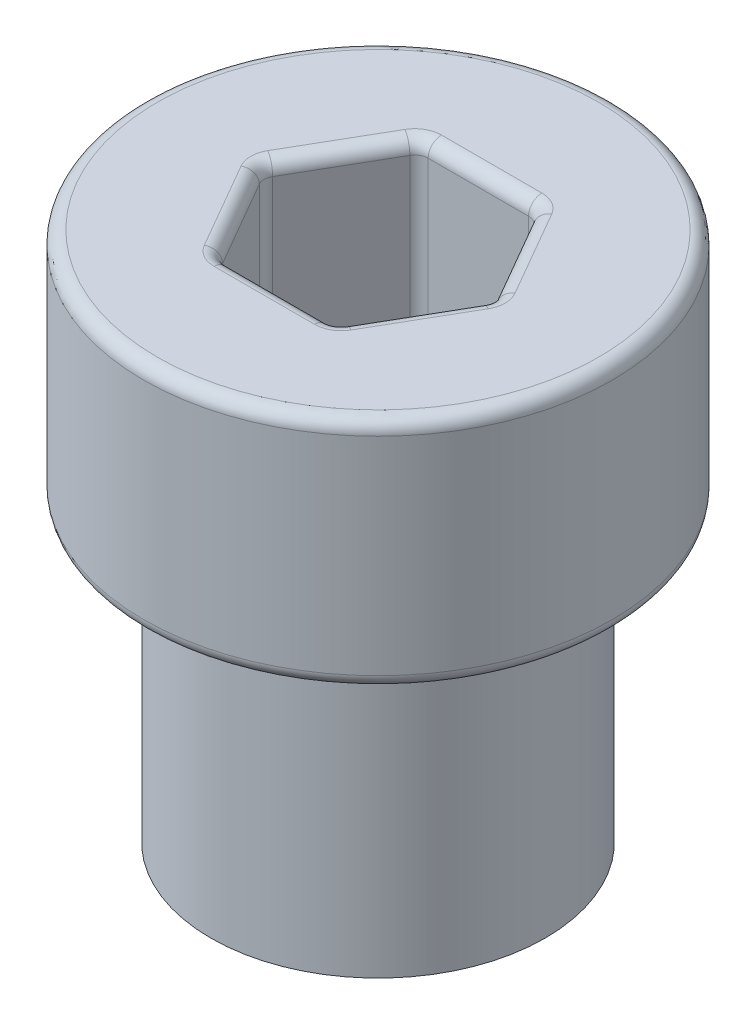
ISO-10303-21;
HEADER;
FILE_DESCRIPTION(('STEP AP214'),'2;1');
FILE_NAME('part.step','',(''),(''),'','','');
FILE_SCHEMA(('AUTOMOTIVE_DESIGN { 1 0 10303 214 1 1 1 1 }'));
ENDSEC;
DATA;
#1=APPLICATION_CONTEXT('core data for automotive mechanical design processes');
#2=APPLICATION_PROTOCOL_DEFINITION('international standard','automotive_design',2000,#1);
#3=PRODUCT_CONTEXT('',#1,'mechanical');
#4=PRODUCT('Part','Part','',(#3));
#5=PRODUCT_RELATED_PRODUCT_CATEGORY('part','',(#4));
#6=PRODUCT_DEFINITION_FORMATION('','',#4);
#7=PRODUCT_DEFINITION_CONTEXT('part definition',#1,'design');
#8=PRODUCT_DEFINITION('design','',#6,#7);
#9=PRODUCT_DEFINITION_SHAPE('','',#8);
#10=(LENGTH_UNIT() NAMED_UNIT(*) SI_UNIT(.MILLI.,.METRE.));
#11=(NAMED_UNIT(*) PLANE_ANGLE_UNIT() SI_UNIT($,.RADIAN.));
#12=(NAMED_UNIT(*) SI_UNIT($,.STERADIAN.) SOLID_ANGLE_UNIT());
#13=UNCERTAINTY_MEASURE_WITH_UNIT(LENGTH_MEASURE(1.E-05),#10,'distance_accuracy_value','');
#14=(GEOMETRIC_REPRESENTATION_CONTEXT(3) GLOBAL_UNCERTAINTY_ASSIGNED_CONTEXT((#13)) GLOBAL_UNIT_ASSIGNED_CONTEXT((#10,
#11,#12)) REPRESENTATION_CONTEXT('',''));
#15=CARTESIAN_POINT('',(0.,0.,0.));
#16=DIRECTION('',(0.,0.,1.));
#17=DIRECTION('',(1.,0.,0.));
#18=AXIS2_PLACEMENT_3D('',#15,#16,#17);
#19=CARTESIAN_POINT('',(0.,3.5,0.));
#20=DIRECTION('',(0.,1.,0.));
#21=DIRECTION('',(0.,0.,1.));
#22=AXIS2_PLACEMENT_3D('',#19,#20,#21);
#23=PLANE('',#22);
#24=CARTESIAN_POINT('',(0.,3.5,0.));
#25=DIRECTION('',(0.,1.,0.));
#26=DIRECTION('',(0.,0.,1.));
#27=AXIS2_PLACEMENT_3D('',#24,#25,#26);
#28=CIRCLE('',#27,3.3);
#29=CARTESIAN_POINT('',(0.,3.5,3.3));
#30=VERTEX_POINT('',#29);
#31=EDGE_CURVE('E896',#30,#30,#28,.T.);
#32=ORIENTED_EDGE('',*,*,#31,.T.);
#33=EDGE_LOOP('',(#32));
#34=FACE_BOUND('',#33,.T.);
#35=CARTESIAN_POINT('',(-0.750555349946514,3.5,-1.3));
#36=DIRECTION('',(0.,1.,0.));
#37=DIRECTION('',(0.,0.,1.));
#38=AXIS2_PLACEMENT_3D('',#35,#36,#37);
#39=CIRCLE('',#38,0.4);
#40=CARTESIAN_POINT('',(-0.750555349946514,3.5,-1.7));
#41=VERTEX_POINT('',#40);
#42=CARTESIAN_POINT('',(-1.09696551146029,3.5,-1.5));
#43=VERTEX_POINT('',#42);
#44=EDGE_CURVE('E889',#41,#43,#39,.T.);
#45=ORIENTED_EDGE('',*,*,#44,.F.);
#46=DIRECTION('',(-1.,0.,0.));
#47=VECTOR('',#46,1.);
#48=CARTESIAN_POINT('',(0.,3.5,-1.7));
#49=LINE('',#48,#47);
#50=CARTESIAN_POINT('',(0.750555349946513,3.5,-1.7));
#51=VERTEX_POINT('',#50);
#52=EDGE_CURVE('E887',#41,#51,#49,.F.);
#53=ORIENTED_EDGE('',*,*,#52,.T.);
#54=CARTESIAN_POINT('',(0.750555349946513,3.5,-1.3));
#55=DIRECTION('',(0.,1.,0.));
#56=DIRECTION('',(0.,0.,1.));
#57=AXIS2_PLACEMENT_3D('',#54,#55,#56);
#58=CIRCLE('',#57,0.4);
#59=CARTESIAN_POINT('',(1.09696551146029,3.5,-1.5));
#60=VERTEX_POINT('',#59);
#61=EDGE_CURVE('E884',#60,#51,#58,.T.);
#62=ORIENTED_EDGE('',*,*,#61,.F.);
#63=DIRECTION('',(-0.5,0.,-0.866025403784439));
#64=VECTOR('',#63,1.);
#65=CARTESIAN_POINT('',(1.47224318643355,3.5,-0.85));
#66=LINE('',#65,#64);
#67=CARTESIAN_POINT('',(1.8475208614068,3.5,-0.2));
#68=VERTEX_POINT('',#67);
#69=EDGE_CURVE('E911',#60,#68,#66,.F.);
#70=ORIENTED_EDGE('',*,*,#69,.T.);
#71=CARTESIAN_POINT('',(1.50111069989303,3.5,0.));
#72=DIRECTION('',(0.,1.,0.));
#73=DIRECTION('',(0.,0.,1.));
#74=AXIS2_PLACEMENT_3D('',#71,#72,#73);
#75=CIRCLE('',#74,0.4);
#76=CARTESIAN_POINT('',(1.8475208614068,3.5,0.2));
#77=VERTEX_POINT('',#76);
#78=EDGE_CURVE('E205',#77,#68,#75,.T.);
#79=ORIENTED_EDGE('',*,*,#78,.F.);
#80=DIRECTION('',(0.5,0.,-0.866025403784439));
#81=VECTOR('',#80,1.);
#82=CARTESIAN_POINT('',(1.47224318643355,3.5,0.85));
#83=LINE('',#82,#81);
#84=CARTESIAN_POINT('',(1.09696551146029,3.5,1.5));
#85=VERTEX_POINT('',#84);
#86=EDGE_CURVE('E206',#77,#85,#83,.F.);
#87=ORIENTED_EDGE('',*,*,#86,.T.);
#88=CARTESIAN_POINT('',(0.750555349946514,3.5,1.3));
#89=DIRECTION('',(0.,1.,0.));
#90=DIRECTION('',(0.,0.,1.));
#91=AXIS2_PLACEMENT_3D('',#88,#89,#90);
#92=CIRCLE('',#91,0.4);
#93=CARTESIAN_POINT('',(0.750555349946514,3.5,1.7));
#94=VERTEX_POINT('',#93);
#95=EDGE_CURVE('E916',#94,#85,#92,.T.);
#96=ORIENTED_EDGE('',*,*,#95,.F.);
#97=DIRECTION('',(1.,0.,0.));
#98=VECTOR('',#97,1.);
#99=CARTESIAN_POINT('',(0.,3.5,1.7));
#100=LINE('',#99,#98);
#101=CARTESIAN_POINT('',(-0.750555349946513,3.5,1.7));
#102=VERTEX_POINT('',#101);
#103=EDGE_CURVE('E189',#94,#102,#100,.F.);
#104=ORIENTED_EDGE('',*,*,#103,.T.);
#105=CARTESIAN_POINT('',(-0.750555349946513,3.5,1.3));
#106=DIRECTION('',(0.,1.,0.));
#107=DIRECTION('',(0.,0.,1.));
#108=AXIS2_PLACEMENT_3D('',#105,#106,#107);
#109=CIRCLE('',#108,0.4);
#110=CARTESIAN_POINT('',(-1.09696551146029,3.5,1.5));
#111=VERTEX_POINT('',#110);
#112=EDGE_CURVE('E184',#111,#102,#109,.T.);
#113=ORIENTED_EDGE('',*,*,#112,.F.);
#114=DIRECTION('',(0.5,0.,0.866025403784439));
#115=VECTOR('',#114,1.);
#116=CARTESIAN_POINT('',(-1.47224318643355,3.5,0.85));
#117=LINE('',#116,#115);
#118=CARTESIAN_POINT('',(-1.8475208614068,3.5,0.2));
#119=VERTEX_POINT('',#118);
#120=EDGE_CURVE('E186',#111,#119,#117,.F.);
#121=ORIENTED_EDGE('',*,*,#120,.T.);
#122=CARTESIAN_POINT('',(-1.50111069989303,3.5,0.));
#123=DIRECTION('',(0.,1.,0.));
#124=DIRECTION('',(0.,0.,1.));
#125=AXIS2_PLACEMENT_3D('',#122,#123,#124);
#126=CIRCLE('',#125,0.4);
#127=CARTESIAN_POINT('',(-1.8475208614068,3.5,-0.2));
#128=VERTEX_POINT('',#127);
#129=EDGE_CURVE('E891',#128,#119,#126,.T.);
#130=ORIENTED_EDGE('',*,*,#129,.F.);
#131=DIRECTION('',(-0.5,0.,0.866025403784439));
#132=VECTOR('',#131,1.);
#133=CARTESIAN_POINT('',(-1.47224318643355,3.5,-0.85));
#134=LINE('',#133,#132);
#135=EDGE_CURVE('E444',#128,#43,#134,.F.);
#136=ORIENTED_EDGE('',*,*,#135,.T.);
#137=EDGE_LOOP('',(#45,#53,#62,#70,#79,#87,#96,#104,#113,#121,#130,#136));
#138=FACE_BOUND('',#137,.T.);
#139=ADVANCED_FACE('F41',(#34,#138),#23,.T.);
#140=CARTESIAN_POINT('',(0.,0.,0.));
#141=DIRECTION('',(0.,1.,0.));
#142=DIRECTION('',(0.,0.,1.));
#143=AXIS2_PLACEMENT_3D('',#140,#141,#142);
#144=PLANE('',#143);
#145=CARTESIAN_POINT('',(0.,0.,0.));
#146=DIRECTION('',(0.,1.,0.));
#147=DIRECTION('',(0.,0.,1.));
#148=AXIS2_PLACEMENT_3D('',#145,#146,#147);
#149=CIRCLE('',#148,3.3);
#150=CARTESIAN_POINT('',(0.,0.,3.3));
#151=VERTEX_POINT('',#150);
#152=EDGE_CURVE('E194',#151,#151,#149,.F.);
#153=ORIENTED_EDGE('',*,*,#152,.T.);
#154=EDGE_LOOP('',(#153));
#155=FACE_BOUND('',#154,.T.);
#156=CARTESIAN_POINT('',(0.,0.,0.));
#157=DIRECTION('',(0.,1.,0.));
#158=DIRECTION('',(0.,0.,1.));
#159=AXIS2_PLACEMENT_3D('',#156,#157,#158);
#160=CIRCLE('',#159,2.5);
#161=CARTESIAN_POINT('',(0.,0.,2.5));
#162=VERTEX_POINT('',#161);
#163=EDGE_CURVE('E233',#162,#162,#160,.T.);
#164=ORIENTED_EDGE('',*,*,#163,.T.);
#165=EDGE_LOOP('',(#164));
#166=FACE_BOUND('',#165,.T.);
#167=ADVANCED_FACE('F464',(#155,#166),#144,.F.);
#168=CARTESIAN_POINT('',(0.,3.5,0.));
#169=DIRECTION('',(0.,-1.,0.));
#170=DIRECTION('',(0.,0.,-1.));
#171=AXIS2_PLACEMENT_3D('',#168,#169,#170);
#172=CYLINDRICAL_SURFACE('',#171,3.5);
#173=CARTESIAN_POINT('',(0.,0.2,0.));
#174=DIRECTION('',(0.,1.,0.));
#175=DIRECTION('',(0.,0.,1.));
#176=AXIS2_PLACEMENT_3D('',#173,#174,#175);
#177=CIRCLE('',#176,3.5);
#178=CARTESIAN_POINT('',(0.,0.2,3.5));
#179=VERTEX_POINT('',#178);
#180=EDGE_CURVE('E921',#179,#179,#177,.T.);
#181=ORIENTED_EDGE('',*,*,#180,.T.);
#182=EDGE_LOOP('',(#181));
#183=FACE_BOUND('',#182,.T.);
#184=CARTESIAN_POINT('',(0.,3.3,0.));
#185=DIRECTION('',(0.,1.,0.));
#186=DIRECTION('',(0.,0.,1.));
#187=AXIS2_PLACEMENT_3D('',#184,#185,#186);
#188=CIRCLE('',#187,3.5);
#189=CARTESIAN_POINT('',(0.,3.3,3.5));
#190=VERTEX_POINT('',#189);
#191=EDGE_CURVE('E924',#190,#190,#188,.F.);
#192=ORIENTED_EDGE('',*,*,#191,.T.);
#193=EDGE_LOOP('',(#192));
#194=FACE_BOUND('',#193,.T.);
#195=ADVANCED_FACE('F470',(#183,#194),#172,.T.);
#196=CARTESIAN_POINT('',(0.866025403784438,3.5,-1.5));
#197=DIRECTION('',(0.,0.,1.));
#198=DIRECTION('',(1.,0.,0.));
#199=AXIS2_PLACEMENT_3D('',#196,#197,#198);
#200=PLANE('',#199);
#201=DIRECTION('',(0.,-1.,0.));
#202=VECTOR('',#201,1.);
#203=CARTESIAN_POINT('',(0.750555349946513,3.5,-1.5));
#204=LINE('',#203,#202);
#205=CARTESIAN_POINT('',(0.750555349946513,0.2,-1.5));
#206=VERTEX_POINT('',#205);
#207=CARTESIAN_POINT('',(0.750555349946513,3.3,-1.5));
#208=VERTEX_POINT('',#207);
#209=EDGE_CURVE('E372',#206,#208,#204,.F.);
#210=ORIENTED_EDGE('',*,*,#209,.T.);
#211=DIRECTION('',(-1.,0.,0.));
#212=VECTOR('',#211,1.);
#213=CARTESIAN_POINT('',(0.866025403784438,3.3,-1.5));
#214=LINE('',#213,#212);
#215=CARTESIAN_POINT('',(-0.750555349946514,3.3,-1.5));
#216=VERTEX_POINT('',#215);
#217=EDGE_CURVE('E367',#208,#216,#214,.T.);
#218=ORIENTED_EDGE('',*,*,#217,.T.);
#219=DIRECTION('',(0.,-1.,0.));
#220=VECTOR('',#219,1.);
#221=CARTESIAN_POINT('',(-0.750555349946514,0.,-1.5));
#222=LINE('',#221,#220);
#223=CARTESIAN_POINT('',(-0.750555349946514,0.2,-1.5));
#224=VERTEX_POINT('',#223);
#225=EDGE_CURVE('E875',#216,#224,#222,.T.);
#226=ORIENTED_EDGE('',*,*,#225,.T.);
#227=DIRECTION('',(-1.,0.,0.));
#228=VECTOR('',#227,1.);
#229=CARTESIAN_POINT('',(0.866025403784438,0.2,-1.5));
#230=LINE('',#229,#228);
#231=EDGE_CURVE('E428',#224,#206,#230,.F.);
#232=ORIENTED_EDGE('',*,*,#231,.T.);
#233=EDGE_LOOP('',(#210,#218,#226,#232));
#234=FACE_BOUND('',#233,.T.);
#235=ADVANCED_FACE('F475',(#234),#200,.T.);
#236=CARTESIAN_POINT('',(-0.866025403784439,3.5,-1.5));
#237=DIRECTION('',(0.866025403784439,0.,0.5));
#238=DIRECTION('',(0.5,0.,-0.866025403784439));
#239=AXIS2_PLACEMENT_3D('',#236,#237,#238);
#240=PLANE('',#239);
#241=DIRECTION('',(0.,-1.,0.));
#242=VECTOR('',#241,1.);
#243=CARTESIAN_POINT('',(-0.923760430703402,3.5,-1.4));
#244=LINE('',#243,#242);
#245=CARTESIAN_POINT('',(-0.923760430703402,0.2,-1.4));
#246=VERTEX_POINT('',#245);
#247=CARTESIAN_POINT('',(-0.923760430703402,3.3,-1.4));
#248=VERTEX_POINT('',#247);
#249=EDGE_CURVE('E369',#246,#248,#244,.F.);
#250=ORIENTED_EDGE('',*,*,#249,.T.);
#251=DIRECTION('',(-0.5,0.,0.866025403784439));
#252=VECTOR('',#251,1.);
#253=CARTESIAN_POINT('',(-0.866025403784439,3.3,-1.5));
#254=LINE('',#253,#252);
#255=CARTESIAN_POINT('',(-1.67431578064991,3.3,-0.0999999999999999));
#256=VERTEX_POINT('',#255);
#257=EDGE_CURVE('E377',#248,#256,#254,.T.);
#258=ORIENTED_EDGE('',*,*,#257,.T.);
#259=DIRECTION('',(0.,-1.,0.));
#260=VECTOR('',#259,1.);
#261=CARTESIAN_POINT('',(-1.67431578064991,0.,-0.0999999999999999));
#262=LINE('',#261,#260);
#263=CARTESIAN_POINT('',(-1.67431578064991,0.2,-0.0999999999999999));
#264=VERTEX_POINT('',#263);
#265=EDGE_CURVE('E366',#256,#264,#262,.T.);
#266=ORIENTED_EDGE('',*,*,#265,.T.);
#267=DIRECTION('',(-0.5,0.,0.866025403784439));
#268=VECTOR('',#267,1.);
#269=CARTESIAN_POINT('',(-0.866025403784439,0.2,-1.5));
#270=LINE('',#269,#268);
#271=EDGE_CURVE('E363',#264,#246,#270,.F.);
#272=ORIENTED_EDGE('',*,*,#271,.T.);
#273=EDGE_LOOP('',(#250,#258,#266,#272));
#274=FACE_BOUND('',#273,.T.);
#275=ADVANCED_FACE('F437',(#274),#240,.T.);
#276=CARTESIAN_POINT('',(-1.73205080756888,3.5,0.));
#277=DIRECTION('',(0.866025403784438,0.,-0.5));
#278=DIRECTION('',(-0.5,0.,-0.866025403784439));
#279=AXIS2_PLACEMENT_3D('',#276,#277,#278);
#280=PLANE('',#279);
#281=DIRECTION('',(0.,-1.,0.));
#282=VECTOR('',#281,1.);
#283=CARTESIAN_POINT('',(-1.67431578064991,3.5,0.1));
#284=LINE('',#283,#282);
#285=CARTESIAN_POINT('',(-1.67431578064991,0.2,0.1));
#286=VERTEX_POINT('',#285);
#287=CARTESIAN_POINT('',(-1.67431578064991,3.3,0.1));
#288=VERTEX_POINT('',#287);
#289=EDGE_CURVE('E384',#286,#288,#284,.F.);
#290=ORIENTED_EDGE('',*,*,#289,.T.);
#291=DIRECTION('',(0.5,0.,0.866025403784439));
#292=VECTOR('',#291,1.);
#293=CARTESIAN_POINT('',(-1.73205080756888,3.3,0.));
#294=LINE('',#293,#292);
#295=CARTESIAN_POINT('',(-0.9237604307034,3.3,1.4));
#296=VERTEX_POINT('',#295);
#297=EDGE_CURVE('E386',#288,#296,#294,.T.);
#298=ORIENTED_EDGE('',*,*,#297,.T.);
#299=DIRECTION('',(0.,-1.,0.));
#300=VECTOR('',#299,1.);
#301=CARTESIAN_POINT('',(-0.9237604307034,0.,1.4));
#302=LINE('',#301,#300);
#303=CARTESIAN_POINT('',(-0.9237604307034,0.2,1.4));
#304=VERTEX_POINT('',#303);
#305=EDGE_CURVE('E382',#296,#304,#302,.T.);
#306=ORIENTED_EDGE('',*,*,#305,.T.);
#307=DIRECTION('',(0.5,0.,0.866025403784439));
#308=VECTOR('',#307,1.);
#309=CARTESIAN_POINT('',(-1.73205080756888,0.2,0.));
#310=LINE('',#309,#308);
#311=EDGE_CURVE('E380',#304,#286,#310,.F.);
#312=ORIENTED_EDGE('',*,*,#311,.T.);
#313=EDGE_LOOP('',(#290,#298,#306,#312));
#314=FACE_BOUND('',#313,.T.);
#315=ADVANCED_FACE('F452',(#314),#280,.T.);
#316=CARTESIAN_POINT('',(-0.866025403784438,3.5,1.5));
#317=DIRECTION('',(0.,0.,-1.));
#318=DIRECTION('',(-1.,0.,0.));
#319=AXIS2_PLACEMENT_3D('',#316,#317,#318);
#320=PLANE('',#319);
#321=DIRECTION('',(1.,0.,0.));
#322=VECTOR('',#321,1.);
#323=CARTESIAN_POINT('',(-0.866025403784438,3.3,1.5));
#324=LINE('',#323,#322);
#325=CARTESIAN_POINT('',(-0.750555349946513,3.3,1.5));
#326=VERTEX_POINT('',#325);
#327=CARTESIAN_POINT('',(0.750555349946514,3.3,1.5));
#328=VERTEX_POINT('',#327);
#329=EDGE_CURVE('E334',#326,#328,#324,.T.);
#330=ORIENTED_EDGE('',*,*,#329,.T.);
#331=DIRECTION('',(0.,-1.,0.));
#332=VECTOR('',#331,1.);
#333=CARTESIAN_POINT('',(0.750555349946514,0.,1.5));
#334=LINE('',#333,#332);
#335=CARTESIAN_POINT('',(0.750555349946514,0.2,1.5));
#336=VERTEX_POINT('',#335);
#337=EDGE_CURVE('E331',#328,#336,#334,.T.);
#338=ORIENTED_EDGE('',*,*,#337,.T.);
#339=DIRECTION('',(1.,0.,0.));
#340=VECTOR('',#339,1.);
#341=CARTESIAN_POINT('',(-0.866025403784438,0.2,1.5));
#342=LINE('',#341,#340);
#343=CARTESIAN_POINT('',(-0.750555349946513,0.2,1.5));
#344=VERTEX_POINT('',#343);
#345=EDGE_CURVE('E321',#336,#344,#342,.F.);
#346=ORIENTED_EDGE('',*,*,#345,.T.);
#347=DIRECTION('',(0.,-1.,0.));
#348=VECTOR('',#347,1.);
#349=CARTESIAN_POINT('',(-0.750555349946513,3.5,1.5));
#350=LINE('',#349,#348);
#351=EDGE_CURVE('E327',#344,#326,#350,.F.);
#352=ORIENTED_EDGE('',*,*,#351,.T.);
#353=EDGE_LOOP('',(#330,#338,#346,#352));
#354=FACE_BOUND('',#353,.T.);
#355=ADVANCED_FACE('F332',(#354),#320,.T.);
#356=CARTESIAN_POINT('',(0.866025403784439,3.5,1.5));
#357=DIRECTION('',(-0.866025403784439,0.,-0.5));
#358=DIRECTION('',(-0.5,0.,0.866025403784439));
#359=AXIS2_PLACEMENT_3D('',#356,#357,#358);
#360=PLANE('',#359);
#361=DIRECTION('',(0.5,0.,-0.866025403784439));
#362=VECTOR('',#361,1.);
#363=CARTESIAN_POINT('',(0.866025403784439,3.3,1.5));
#364=LINE('',#363,#362);
#365=CARTESIAN_POINT('',(0.923760430703402,3.3,1.4));
#366=VERTEX_POINT('',#365);
#367=CARTESIAN_POINT('',(1.67431578064991,3.3,0.1));
#368=VERTEX_POINT('',#367);
#369=EDGE_CURVE('E393',#366,#368,#364,.T.);
#370=ORIENTED_EDGE('',*,*,#369,.T.);
#371=DIRECTION('',(0.,-1.,0.));
#372=VECTOR('',#371,1.);
#373=CARTESIAN_POINT('',(1.67431578064991,0.,0.1));
#374=LINE('',#373,#372);
#375=CARTESIAN_POINT('',(1.67431578064991,0.2,0.1));
#376=VERTEX_POINT('',#375);
#377=EDGE_CURVE('E328',#368,#376,#374,.T.);
#378=ORIENTED_EDGE('',*,*,#377,.T.);
#379=DIRECTION('',(0.5,0.,-0.866025403784439));
#380=VECTOR('',#379,1.);
#381=CARTESIAN_POINT('',(0.866025403784439,0.2,1.5));
#382=LINE('',#381,#380);
#383=CARTESIAN_POINT('',(0.923760430703402,0.2,1.4));
#384=VERTEX_POINT('',#383);
#385=EDGE_CURVE('E389',#376,#384,#382,.F.);
#386=ORIENTED_EDGE('',*,*,#385,.T.);
#387=DIRECTION('',(0.,-1.,0.));
#388=VECTOR('',#387,1.);
#389=CARTESIAN_POINT('',(0.923760430703402,3.5,1.4));
#390=LINE('',#389,#388);
#391=EDGE_CURVE('E391',#384,#366,#390,.F.);
#392=ORIENTED_EDGE('',*,*,#391,.T.);
#393=EDGE_LOOP('',(#370,#378,#386,#392));
#394=FACE_BOUND('',#393,.T.);
#395=ADVANCED_FACE('F408',(#394),#360,.T.);
#396=CARTESIAN_POINT('',(1.73205080756888,3.5,0.));
#397=DIRECTION('',(-0.866025403784438,0.,0.5));
#398=DIRECTION('',(0.5,0.,0.866025403784439));
#399=AXIS2_PLACEMENT_3D('',#396,#397,#398);
#400=PLANE('',#399);
#401=DIRECTION('',(0.,-1.,0.));
#402=VECTOR('',#401,1.);
#403=CARTESIAN_POINT('',(1.67431578064991,3.5,-0.1));
#404=LINE('',#403,#402);
#405=CARTESIAN_POINT('',(1.67431578064991,0.2,-0.0999999999999999));
#406=VERTEX_POINT('',#405);
#407=CARTESIAN_POINT('',(1.67431578064991,3.3,-0.0999999999999999));
#408=VERTEX_POINT('',#407);
#409=EDGE_CURVE('E900',#406,#408,#404,.F.);
#410=ORIENTED_EDGE('',*,*,#409,.T.);
#411=DIRECTION('',(-0.5,0.,-0.866025403784439));
#412=VECTOR('',#411,1.);
#413=CARTESIAN_POINT('',(1.73205080756888,3.3,0.));
#414=LINE('',#413,#412);
#415=CARTESIAN_POINT('',(0.923760430703401,3.3,-1.4));
#416=VERTEX_POINT('',#415);
#417=EDGE_CURVE('E903',#408,#416,#414,.T.);
#418=ORIENTED_EDGE('',*,*,#417,.T.);
#419=DIRECTION('',(0.,-1.,0.));
#420=VECTOR('',#419,1.);
#421=CARTESIAN_POINT('',(0.923760430703401,0.,-1.4));
#422=LINE('',#421,#420);
#423=CARTESIAN_POINT('',(0.923760430703401,0.2,-1.4));
#424=VERTEX_POINT('',#423);
#425=EDGE_CURVE('E881',#416,#424,#422,.T.);
#426=ORIENTED_EDGE('',*,*,#425,.T.);
#427=DIRECTION('',(-0.5,0.,-0.866025403784439));
#428=VECTOR('',#427,1.);
#429=CARTESIAN_POINT('',(1.73205080756888,0.2,0.));
#430=LINE('',#429,#428);
#431=EDGE_CURVE('E898',#424,#406,#430,.F.);
#432=ORIENTED_EDGE('',*,*,#431,.T.);
#433=EDGE_LOOP('',(#410,#418,#426,#432));
#434=FACE_BOUND('',#433,.T.);
#435=ADVANCED_FACE('F717',(#434),#400,.T.);
#436=CARTESIAN_POINT('',(0.,0.,0.));
#437=DIRECTION('',(0.,1.,0.));
#438=DIRECTION('',(0.,0.,1.));
#439=AXIS2_PLACEMENT_3D('',#436,#437,#438);
#440=PLANE('',#439);
#441=DIRECTION('',(1.,0.,0.));
#442=VECTOR('',#441,1.);
#443=CARTESIAN_POINT('',(0.866025403784439,0.,1.3));
#444=LINE('',#443,#442);
#445=CARTESIAN_POINT('',(-0.750555349946513,0.,1.3));
#446=VERTEX_POINT('',#445);
#447=CARTESIAN_POINT('',(0.750555349946514,0.,1.3));
#448=VERTEX_POINT('',#447);
#449=EDGE_CURVE('E57',#446,#448,#444,.T.);
#450=ORIENTED_EDGE('',*,*,#449,.T.);
#451=DIRECTION('',(0.5,0.,-0.866025403784439));
#452=VECTOR('',#451,1.);
#453=CARTESIAN_POINT('',(1.55884572681199,0.,-0.1));
#454=LINE('',#453,#452);
#455=CARTESIAN_POINT('',(1.50111069989303,0.,0.));
#456=VERTEX_POINT('',#455);
#457=EDGE_CURVE('E235',#448,#456,#454,.T.);
#458=ORIENTED_EDGE('',*,*,#457,.T.);
#459=DIRECTION('',(-0.5,0.,-0.866025403784439));
#460=VECTOR('',#459,1.);
#461=CARTESIAN_POINT('',(0.692820323027551,0.,-1.4));
#462=LINE('',#461,#460);
#463=CARTESIAN_POINT('',(0.750555349946514,0.,-1.3));
#464=VERTEX_POINT('',#463);
#465=EDGE_CURVE('E338',#456,#464,#462,.T.);
#466=ORIENTED_EDGE('',*,*,#465,.T.);
#467=DIRECTION('',(-1.,0.,0.));
#468=VECTOR('',#467,1.);
#469=CARTESIAN_POINT('',(-0.866025403784439,0.,-1.3));
#470=LINE('',#469,#468);
#471=CARTESIAN_POINT('',(-0.750555349946514,0.,-1.3));
#472=VERTEX_POINT('',#471);
#473=EDGE_CURVE('E340',#464,#472,#470,.T.);
#474=ORIENTED_EDGE('',*,*,#473,.T.);
#475=DIRECTION('',(-0.5,0.,0.866025403784439));
#476=VECTOR('',#475,1.);
#477=CARTESIAN_POINT('',(-1.55884572681199,0.,0.1));
#478=LINE('',#477,#476);
#479=CARTESIAN_POINT('',(-1.50111069989303,0.,0.));
#480=VERTEX_POINT('',#479);
#481=EDGE_CURVE('E346',#472,#480,#478,.T.);
#482=ORIENTED_EDGE('',*,*,#481,.T.);
#483=DIRECTION('',(0.5,0.,0.866025403784439));
#484=VECTOR('',#483,1.);
#485=CARTESIAN_POINT('',(-0.69282032302755,0.,1.4));
#486=LINE('',#485,#484);
#487=EDGE_CURVE('E62',#480,#446,#486,.T.);
#488=ORIENTED_EDGE('',*,*,#487,.T.);
#489=EDGE_LOOP('',(#450,#458,#466,#474,#482,#488));
#490=FACE_BOUND('',#489,.T.);
#491=ADVANCED_FACE('F348',(#490),#440,.T.);
#492=CARTESIAN_POINT('',(0.,-5.,0.));
#493=DIRECTION('',(0.,1.,0.));
#494=DIRECTION('',(0.,0.,1.));
#495=AXIS2_PLACEMENT_3D('',#492,#493,#494);
#496=CYLINDRICAL_SURFACE('',#495,2.5);
#497=CARTESIAN_POINT('',(0.,-4.42264973081037,0.));
#498=DIRECTION('',(0.,1.,0.));
#499=DIRECTION('',(0.,0.,1.));
#500=AXIS2_PLACEMENT_3D('',#497,#498,#499);
#501=CIRCLE('',#500,2.5);
#502=CARTESIAN_POINT('',(0.,-4.42264973081037,2.5));
#503=VERTEX_POINT('',#502);
#504=EDGE_CURVE('E50',#503,#503,#501,.T.);
#505=ORIENTED_EDGE('',*,*,#504,.T.);
#506=EDGE_LOOP('',(#505));
#507=FACE_BOUND('',#506,.T.);
#508=ORIENTED_EDGE('',*,*,#163,.F.);
#509=EDGE_LOOP('',(#508));
#510=FACE_BOUND('',#509,.T.);
#511=ADVANCED_FACE('F685',(#507,#510),#496,.T.);
#512=CARTESIAN_POINT('',(0.,-5.,0.));
#513=DIRECTION('',(0.,1.,0.));
#514=DIRECTION('',(0.,0.,1.));
#515=AXIS2_PLACEMENT_3D('',#512,#513,#514);
#516=PLANE('',#515);
#517=CARTESIAN_POINT('',(0.,-5.,0.));
#518=DIRECTION('',(0.,1.,0.));
#519=DIRECTION('',(0.,0.,1.));
#520=AXIS2_PLACEMENT_3D('',#517,#518,#519);
#521=CIRCLE('',#520,1.49999999999999);
#522=CARTESIAN_POINT('',(0.,-5.,1.49999999999999));
#523=VERTEX_POINT('',#522);
#524=EDGE_CURVE('E11',#523,#523,#521,.F.);
#525=ORIENTED_EDGE('',*,*,#524,.T.);
#526=EDGE_LOOP('',(#525));
#527=FACE_BOUND('',#526,.T.);
#528=ADVANCED_FACE('F484',(#527),#516,.F.);
#529=CARTESIAN_POINT('',(0.,0.2,0.));
#530=DIRECTION('',(0.,1.,0.));
#531=DIRECTION('',(0.,0.,1.));
#532=AXIS2_PLACEMENT_3D('',#529,#530,#531);
#533=TOROIDAL_SURFACE('',#532,3.3,0.2);
#534=ORIENTED_EDGE('',*,*,#152,.F.);
#535=EDGE_LOOP('',(#534));
#536=FACE_BOUND('',#535,.T.);
#537=ORIENTED_EDGE('',*,*,#180,.F.);
#538=EDGE_LOOP('',(#537));
#539=FACE_BOUND('',#538,.T.);
#540=ADVANCED_FACE('F481',(#536,#539),#533,.T.);
#541=CARTESIAN_POINT('',(0.,3.3,0.));
#542=DIRECTION('',(0.,1.,0.));
#543=DIRECTION('',(0.,0.,1.));
#544=AXIS2_PLACEMENT_3D('',#541,#542,#543);
#545=TOROIDAL_SURFACE('',#544,3.3,0.2);
#546=ORIENTED_EDGE('',*,*,#191,.F.);
#547=EDGE_LOOP('',(#546));
#548=FACE_BOUND('',#547,.T.);
#549=ORIENTED_EDGE('',*,*,#31,.F.);
#550=EDGE_LOOP('',(#549));
#551=FACE_BOUND('',#550,.T.);
#552=ADVANCED_FACE('F462',(#548,#551),#545,.T.);
#553=CARTESIAN_POINT('',(-1.12583302491977,0.2,0.65));
#554=DIRECTION('',(-0.5,0.,-0.866025403784439));
#555=DIRECTION('',(-0.866025403784438,0.,0.5));
#556=AXIS2_PLACEMENT_3D('',#553,#554,#555);
#557=CYLINDRICAL_SURFACE('',#556,0.2);
#558=CARTESIAN_POINT('',(-0.750555349946513,0.2,1.3));
#559=DIRECTION('',(-0.5,0.,-0.866025403784439));
#560=DIRECTION('',(-0.866025403784439,0.,0.5));
#561=AXIS2_PLACEMENT_3D('',#558,#559,#560);
#562=CIRCLE('',#561,0.2);
#563=EDGE_CURVE('E231',#446,#304,#562,.T.);
#564=ORIENTED_EDGE('',*,*,#563,.F.);
#565=ORIENTED_EDGE('',*,*,#487,.F.);
#566=CARTESIAN_POINT('',(-1.50111069989303,0.2,0.));
#567=DIRECTION('',(0.5,0.,0.866025403784438));
#568=DIRECTION('',(0.866025403784439,0.,-0.5));
#569=AXIS2_PLACEMENT_3D('',#566,#567,#568);
#570=CIRCLE('',#569,0.2);
#571=EDGE_CURVE('E228',#286,#480,#570,.T.);
#572=ORIENTED_EDGE('',*,*,#571,.F.);
#573=ORIENTED_EDGE('',*,*,#311,.F.);
#574=EDGE_LOOP('',(#564,#565,#572,#573));
#575=FACE_BOUND('',#574,.T.);
#576=ADVANCED_FACE('F354',(#575),#557,.F.);
#577=CARTESIAN_POINT('',(-0.750555349946513,0.2,1.3));
#578=DIRECTION('',(0.,0.,1.));
#579=DIRECTION('',(1.,0.,0.));
#580=AXIS2_PLACEMENT_3D('',#577,#578,#579);
#581=SPHERICAL_SURFACE('',#580,0.2);
#582=CARTESIAN_POINT('',(-0.750555349946513,0.2,1.3));
#583=DIRECTION('',(1.,0.,0.));
#584=DIRECTION('',(0.,1.,0.));
#585=AXIS2_PLACEMENT_3D('',#582,#583,#584);
#586=CIRCLE('',#585,0.2);
#587=EDGE_CURVE('E222',#446,#344,#586,.F.);
#588=ORIENTED_EDGE('',*,*,#587,.F.);
#589=ORIENTED_EDGE('',*,*,#563,.T.);
#590=CARTESIAN_POINT('',(-0.750555349946513,0.2,1.3));
#591=DIRECTION('',(0.,1.,0.));
#592=DIRECTION('',(0.,0.,1.));
#593=AXIS2_PLACEMENT_3D('',#590,#591,#592);
#594=CIRCLE('',#593,0.2);
#595=EDGE_CURVE('E225',#344,#304,#594,.F.);
#596=ORIENTED_EDGE('',*,*,#595,.F.);
#597=EDGE_LOOP('',(#588,#589,#596));
#598=FACE_BOUND('',#597,.T.);
#599=ADVANCED_FACE('F454',(#598),#581,.F.);
#600=CARTESIAN_POINT('',(-1.50111069989303,0.2,0.));
#601=DIRECTION('',(0.,0.,1.));
#602=DIRECTION('',(1.,0.,0.));
#603=AXIS2_PLACEMENT_3D('',#600,#601,#602);
#604=SPHERICAL_SURFACE('',#603,0.2);
#605=CARTESIAN_POINT('',(-1.50111069989303,0.2,0.));
#606=DIRECTION('',(0.,1.,0.));
#607=DIRECTION('',(0.,0.,1.));
#608=AXIS2_PLACEMENT_3D('',#605,#606,#607);
#609=CIRCLE('',#608,0.2);
#610=EDGE_CURVE('E211',#286,#264,#609,.F.);
#611=ORIENTED_EDGE('',*,*,#610,.F.);
#612=ORIENTED_EDGE('',*,*,#571,.T.);
#613=CARTESIAN_POINT('',(-1.50111069989303,0.2,0.));
#614=DIRECTION('',(0.5,0.,-0.866025403784439));
#615=DIRECTION('',(-0.866025403784439,0.,-0.5));
#616=AXIS2_PLACEMENT_3D('',#613,#614,#615);
#617=CIRCLE('',#616,0.2);
#618=EDGE_CURVE('E214',#264,#480,#617,.F.);
#619=ORIENTED_EDGE('',*,*,#618,.F.);
#620=EDGE_LOOP('',(#611,#612,#619));
#621=FACE_BOUND('',#620,.T.);
#622=ADVANCED_FACE('F359',(#621),#604,.F.);
#623=CARTESIAN_POINT('',(-0.750555349946513,3.5,1.3));
#624=DIRECTION('',(0.,1.,0.));
#625=DIRECTION('',(0.,0.,1.));
#626=AXIS2_PLACEMENT_3D('',#623,#624,#625);
#627=CYLINDRICAL_SURFACE('',#626,0.2);
#628=ORIENTED_EDGE('',*,*,#595,.T.);
#629=ORIENTED_EDGE('',*,*,#305,.F.);
#630=CARTESIAN_POINT('',(-0.750555349946513,3.3,1.3));
#631=DIRECTION('',(0.,1.,0.));
#632=DIRECTION('',(0.,0.,1.));
#633=AXIS2_PLACEMENT_3D('',#630,#631,#632);
#634=CIRCLE('',#633,0.2);
#635=EDGE_CURVE('E210',#326,#296,#634,.F.);
#636=ORIENTED_EDGE('',*,*,#635,.F.);
#637=ORIENTED_EDGE('',*,*,#351,.F.);
#638=EDGE_LOOP('',(#628,#629,#636,#637));
#639=FACE_BOUND('',#638,.T.);
#640=ADVANCED_FACE('F398',(#639),#627,.F.);
#641=CARTESIAN_POINT('',(0.,0.2,1.3));
#642=DIRECTION('',(-1.,0.,0.));
#643=DIRECTION('',(0.,0.,1.));
#644=AXIS2_PLACEMENT_3D('',#641,#642,#643);
#645=CYLINDRICAL_SURFACE('',#644,0.2);
#646=ORIENTED_EDGE('',*,*,#587,.T.);
#647=ORIENTED_EDGE('',*,*,#345,.F.);
#648=CARTESIAN_POINT('',(0.750555349946514,0.2,1.3));
#649=DIRECTION('',(-1.,0.,0.));
#650=DIRECTION('',(0.,0.,1.));
#651=AXIS2_PLACEMENT_3D('',#648,#649,#650);
#652=CIRCLE('',#651,0.2);
#653=EDGE_CURVE('E216',#448,#336,#652,.T.);
#654=ORIENTED_EDGE('',*,*,#653,.F.);
#655=ORIENTED_EDGE('',*,*,#449,.F.);
#656=EDGE_LOOP('',(#646,#647,#654,#655));
#657=FACE_BOUND('',#656,.T.);
#658=ADVANCED_FACE('F323',(#657),#645,.F.);
#659=CARTESIAN_POINT('',(-1.12583302491977,0.2,-0.65));
#660=DIRECTION('',(0.5,0.,-0.866025403784439));
#661=DIRECTION('',(-0.866025403784439,0.,-0.5));
#662=AXIS2_PLACEMENT_3D('',#659,#660,#661);
#663=CYLINDRICAL_SURFACE('',#662,0.2);
#664=ORIENTED_EDGE('',*,*,#618,.T.);
#665=ORIENTED_EDGE('',*,*,#481,.F.);
#666=CARTESIAN_POINT('',(-0.750555349946514,0.2,-1.3));
#667=DIRECTION('',(-0.5,0.,0.866025403784439));
#668=DIRECTION('',(0.866025403784439,0.,0.5));
#669=AXIS2_PLACEMENT_3D('',#666,#667,#668);
#670=CIRCLE('',#669,0.2);
#671=EDGE_CURVE('E311',#246,#472,#670,.T.);
#672=ORIENTED_EDGE('',*,*,#671,.F.);
#673=ORIENTED_EDGE('',*,*,#271,.F.);
#674=EDGE_LOOP('',(#664,#665,#672,#673));
#675=FACE_BOUND('',#674,.T.);
#676=ADVANCED_FACE('F362',(#675),#663,.F.);
#677=CARTESIAN_POINT('',(-1.50111069989303,3.5,0.));
#678=DIRECTION('',(0.,1.,0.));
#679=DIRECTION('',(0.,0.,1.));
#680=AXIS2_PLACEMENT_3D('',#677,#678,#679);
#681=CYLINDRICAL_SURFACE('',#680,0.2);
#682=ORIENTED_EDGE('',*,*,#610,.T.);
#683=ORIENTED_EDGE('',*,*,#265,.F.);
#684=CARTESIAN_POINT('',(-1.50111069989303,3.3,0.));
#685=DIRECTION('',(0.,1.,0.));
#686=DIRECTION('',(0.,0.,1.));
#687=AXIS2_PLACEMENT_3D('',#684,#685,#686);
#688=CIRCLE('',#687,0.2);
#689=EDGE_CURVE('E308',#288,#256,#688,.F.);
#690=ORIENTED_EDGE('',*,*,#689,.F.);
#691=ORIENTED_EDGE('',*,*,#289,.F.);
#692=EDGE_LOOP('',(#682,#683,#690,#691));
#693=FACE_BOUND('',#692,.T.);
#694=ADVANCED_FACE('F450',(#693),#681,.F.);
#695=CARTESIAN_POINT('',(-1.90525588832576,3.3,0.1));
#696=DIRECTION('',(0.5,0.,0.866025403784439));
#697=DIRECTION('',(0.866025403784438,0.,-0.5));
#698=AXIS2_PLACEMENT_3D('',#695,#696,#697);
#699=CYLINDRICAL_SURFACE('',#698,0.2);
#700=CARTESIAN_POINT('',(-1.8475208614068,3.3,0.2));
#701=DIRECTION('',(-0.5,0.,-0.866025403784438));
#702=DIRECTION('',(-0.866025403784439,0.,0.5));
#703=AXIS2_PLACEMENT_3D('',#700,#701,#702);
#704=CIRCLE('',#703,0.2);
#705=EDGE_CURVE('E203',#119,#288,#704,.T.);
#706=ORIENTED_EDGE('',*,*,#705,.F.);
#707=ORIENTED_EDGE('',*,*,#120,.F.);
#708=CARTESIAN_POINT('',(-1.09696551146029,3.3,1.5));
#709=DIRECTION('',(0.5,0.,0.866025403784438));
#710=DIRECTION('',(0.866025403784439,0.,-0.5));
#711=AXIS2_PLACEMENT_3D('',#708,#709,#710);
#712=CIRCLE('',#711,0.2);
#713=EDGE_CURVE('E200',#296,#111,#712,.T.);
#714=ORIENTED_EDGE('',*,*,#713,.F.);
#715=ORIENTED_EDGE('',*,*,#297,.F.);
#716=EDGE_LOOP('',(#706,#707,#714,#715));
#717=FACE_BOUND('',#716,.T.);
#718=ADVANCED_FACE('F198',(#717),#699,.T.);
#719=CARTESIAN_POINT('',(-0.750555349946513,3.3,1.3));
#720=DIRECTION('',(0.,1.,0.));
#721=DIRECTION('',(0.,0.,1.));
#722=AXIS2_PLACEMENT_3D('',#719,#720,#721);
#723=TOROIDAL_SURFACE('',#722,0.4,0.2);
#724=ORIENTED_EDGE('',*,*,#713,.T.);
#725=ORIENTED_EDGE('',*,*,#112,.T.);
#726=CARTESIAN_POINT('',(-0.750555349946513,3.3,1.7));
#727=DIRECTION('',(-1.,0.,0.));
#728=DIRECTION('',(0.,0.,1.));
#729=AXIS2_PLACEMENT_3D('',#726,#727,#728);
#730=CIRCLE('',#729,0.2);
#731=EDGE_CURVE('E305',#326,#102,#730,.F.);
#732=ORIENTED_EDGE('',*,*,#731,.F.);
#733=ORIENTED_EDGE('',*,*,#635,.T.);
#734=EDGE_LOOP('',(#724,#725,#732,#733));
#735=FACE_BOUND('',#734,.T.);
#736=ADVANCED_FACE('F208',(#735),#723,.T.);
#737=CARTESIAN_POINT('',(0.750555349946514,0.2,1.3));
#738=DIRECTION('',(0.,0.,1.));
#739=DIRECTION('',(1.,0.,0.));
#740=AXIS2_PLACEMENT_3D('',#737,#738,#739);
#741=SPHERICAL_SURFACE('',#740,0.2);
#742=CARTESIAN_POINT('',(0.750555349946514,0.2,1.3));
#743=DIRECTION('',(0.5,0.,-0.866025403784439));
#744=DIRECTION('',(-0.866025403784439,0.,-0.5));
#745=AXIS2_PLACEMENT_3D('',#742,#743,#744);
#746=CIRCLE('',#745,0.2);
#747=EDGE_CURVE('E300',#448,#384,#746,.F.);
#748=ORIENTED_EDGE('',*,*,#747,.F.);
#749=ORIENTED_EDGE('',*,*,#653,.T.);
#750=CARTESIAN_POINT('',(0.750555349946514,0.2,1.3));
#751=DIRECTION('',(0.,1.,0.));
#752=DIRECTION('',(0.,0.,1.));
#753=AXIS2_PLACEMENT_3D('',#750,#751,#752);
#754=CIRCLE('',#753,0.2);
#755=EDGE_CURVE('E303',#384,#336,#754,.F.);
#756=ORIENTED_EDGE('',*,*,#755,.F.);
#757=EDGE_LOOP('',(#748,#749,#756));
#758=FACE_BOUND('',#757,.T.);
#759=ADVANCED_FACE('F318',(#758),#741,.F.);
#760=CARTESIAN_POINT('',(-0.750555349946514,0.2,-1.3));
#761=DIRECTION('',(0.,0.,1.));
#762=DIRECTION('',(1.,0.,0.));
#763=AXIS2_PLACEMENT_3D('',#760,#761,#762);
#764=SPHERICAL_SURFACE('',#763,0.2);
#765=CARTESIAN_POINT('',(-0.750555349946514,0.2,-1.3));
#766=DIRECTION('',(0.,1.,0.));
#767=DIRECTION('',(0.,0.,1.));
#768=AXIS2_PLACEMENT_3D('',#765,#766,#767);
#769=CIRCLE('',#768,0.2);
#770=EDGE_CURVE('E294',#246,#224,#769,.F.);
#771=ORIENTED_EDGE('',*,*,#770,.F.);
#772=ORIENTED_EDGE('',*,*,#671,.T.);
#773=CARTESIAN_POINT('',(-0.750555349946514,0.2,-1.3));
#774=DIRECTION('',(1.,0.,0.));
#775=DIRECTION('',(0.,0.,-1.));
#776=AXIS2_PLACEMENT_3D('',#773,#774,#775);
#777=CIRCLE('',#776,0.2);
#778=EDGE_CURVE('E297',#224,#472,#777,.F.);
#779=ORIENTED_EDGE('',*,*,#778,.F.);
#780=EDGE_LOOP('',(#771,#772,#779));
#781=FACE_BOUND('',#780,.T.);
#782=ADVANCED_FACE('F430',(#781),#764,.F.);
#783=CARTESIAN_POINT('',(-1.50111069989303,3.3,0.));
#784=DIRECTION('',(0.,1.,0.));
#785=DIRECTION('',(0.,0.,1.));
#786=AXIS2_PLACEMENT_3D('',#783,#784,#785);
#787=TOROIDAL_SURFACE('',#786,0.4,0.2);
#788=ORIENTED_EDGE('',*,*,#705,.T.);
#789=ORIENTED_EDGE('',*,*,#689,.T.);
#790=CARTESIAN_POINT('',(-1.8475208614068,3.3,-0.2));
#791=DIRECTION('',(-0.5,0.,0.866025403784439));
#792=DIRECTION('',(0.866025403784439,0.,0.5));
#793=AXIS2_PLACEMENT_3D('',#790,#791,#792);
#794=CIRCLE('',#793,0.2);
#795=EDGE_CURVE('E292',#128,#256,#794,.F.);
#796=ORIENTED_EDGE('',*,*,#795,.F.);
#797=ORIENTED_EDGE('',*,*,#129,.T.);
#798=EDGE_LOOP('',(#788,#789,#796,#797));
#799=FACE_BOUND('',#798,.T.);
#800=ADVANCED_FACE('F448',(#799),#787,.T.);
#801=CARTESIAN_POINT('',(-0.866025403784438,3.3,1.7));
#802=DIRECTION('',(1.,0.,0.));
#803=DIRECTION('',(0.,0.,-1.));
#804=AXIS2_PLACEMENT_3D('',#801,#802,#803);
#805=CYLINDRICAL_SURFACE('',#804,0.2);
#806=ORIENTED_EDGE('',*,*,#731,.T.);
#807=ORIENTED_EDGE('',*,*,#103,.F.);
#808=CARTESIAN_POINT('',(0.750555349946514,3.3,1.7));
#809=DIRECTION('',(1.,0.,0.));
#810=DIRECTION('',(0.,0.,-1.));
#811=AXIS2_PLACEMENT_3D('',#808,#809,#810);
#812=CIRCLE('',#811,0.2);
#813=EDGE_CURVE('E289',#328,#94,#812,.T.);
#814=ORIENTED_EDGE('',*,*,#813,.F.);
#815=ORIENTED_EDGE('',*,*,#329,.F.);
#816=EDGE_LOOP('',(#806,#807,#814,#815));
#817=FACE_BOUND('',#816,.T.);
#818=ADVANCED_FACE('F400',(#817),#805,.T.);
#819=CARTESIAN_POINT('',(0.750555349946514,3.5,1.3));
#820=DIRECTION('',(0.,1.,0.));
#821=DIRECTION('',(0.,0.,1.));
#822=AXIS2_PLACEMENT_3D('',#819,#820,#821);
#823=CYLINDRICAL_SURFACE('',#822,0.2);
#824=ORIENTED_EDGE('',*,*,#755,.T.);
#825=ORIENTED_EDGE('',*,*,#337,.F.);
#826=CARTESIAN_POINT('',(0.750555349946514,3.3,1.3));
#827=DIRECTION('',(0.,1.,0.));
#828=DIRECTION('',(0.,0.,1.));
#829=AXIS2_PLACEMENT_3D('',#826,#827,#828);
#830=CIRCLE('',#829,0.2);
#831=EDGE_CURVE('E286',#366,#328,#830,.F.);
#832=ORIENTED_EDGE('',*,*,#831,.F.);
#833=ORIENTED_EDGE('',*,*,#391,.F.);
#834=EDGE_LOOP('',(#824,#825,#832,#833));
#835=FACE_BOUND('',#834,.T.);
#836=ADVANCED_FACE('F406',(#835),#823,.F.);
#837=CARTESIAN_POINT('',(1.12583302491977,0.2,0.65));
#838=DIRECTION('',(-0.5,0.,0.866025403784439));
#839=DIRECTION('',(0.866025403784439,0.,0.5));
#840=AXIS2_PLACEMENT_3D('',#837,#838,#839);
#841=CYLINDRICAL_SURFACE('',#840,0.2);
#842=ORIENTED_EDGE('',*,*,#747,.T.);
#843=ORIENTED_EDGE('',*,*,#385,.F.);
#844=CARTESIAN_POINT('',(1.50111069989303,0.2,0.));
#845=DIRECTION('',(-0.500000000000002,0.,0.866025403784438));
#846=DIRECTION('',(0.866025403784438,0.,0.500000000000002));
#847=AXIS2_PLACEMENT_3D('',#844,#845,#846);
#848=CIRCLE('',#847,0.2);
#849=EDGE_CURVE('E283',#456,#376,#848,.T.);
#850=ORIENTED_EDGE('',*,*,#849,.F.);
#851=ORIENTED_EDGE('',*,*,#457,.F.);
#852=EDGE_LOOP('',(#842,#843,#850,#851));
#853=FACE_BOUND('',#852,.T.);
#854=ADVANCED_FACE('F413',(#853),#841,.F.);
#855=CARTESIAN_POINT('',(1.12583302491977,0.2,-0.65));
#856=DIRECTION('',(0.5,0.,0.866025403784439));
#857=DIRECTION('',(0.866025403784438,0.,-0.5));
#858=AXIS2_PLACEMENT_3D('',#855,#856,#857);
#859=CYLINDRICAL_SURFACE('',#858,0.2);
#860=CARTESIAN_POINT('',(0.750555349946514,0.2,-1.3));
#861=DIRECTION('',(0.500000000000002,0.,0.866025403784438));
#862=DIRECTION('',(0.866025403784438,0.,-0.500000000000002));
#863=AXIS2_PLACEMENT_3D('',#860,#861,#862);
#864=CIRCLE('',#863,0.2);
#865=EDGE_CURVE('E278',#464,#424,#864,.T.);
#866=ORIENTED_EDGE('',*,*,#865,.F.);
#867=ORIENTED_EDGE('',*,*,#465,.F.);
#868=CARTESIAN_POINT('',(1.50111069989303,0.2,0.));
#869=DIRECTION('',(-0.5,0.,-0.866025403784439));
#870=DIRECTION('',(-0.866025403784439,0.,0.5));
#871=AXIS2_PLACEMENT_3D('',#868,#869,#870);
#872=CIRCLE('',#871,0.2);
#873=EDGE_CURVE('E281',#406,#456,#872,.T.);
#874=ORIENTED_EDGE('',*,*,#873,.F.);
#875=ORIENTED_EDGE('',*,*,#431,.F.);
#876=EDGE_LOOP('',(#866,#867,#874,#875));
#877=FACE_BOUND('',#876,.T.);
#878=ADVANCED_FACE('F420',(#877),#859,.F.);
#879=CARTESIAN_POINT('',(0.,0.2,-1.3));
#880=DIRECTION('',(1.,0.,0.));
#881=DIRECTION('',(0.,0.,-1.));
#882=AXIS2_PLACEMENT_3D('',#879,#880,#881);
#883=CYLINDRICAL_SURFACE('',#882,0.2);
#884=ORIENTED_EDGE('',*,*,#778,.T.);
#885=ORIENTED_EDGE('',*,*,#473,.F.);
#886=CARTESIAN_POINT('',(0.750555349946513,0.2,-1.3));
#887=DIRECTION('',(-1.,0.,0.));
#888=DIRECTION('',(0.,-1.,0.));
#889=AXIS2_PLACEMENT_3D('',#886,#887,#888);
#890=CIRCLE('',#889,0.2);
#891=EDGE_CURVE('E275',#206,#464,#890,.T.);
#892=ORIENTED_EDGE('',*,*,#891,.F.);
#893=ORIENTED_EDGE('',*,*,#231,.F.);
#894=EDGE_LOOP('',(#884,#885,#892,#893));
#895=FACE_BOUND('',#894,.T.);
#896=ADVANCED_FACE('F424',(#895),#883,.F.);
#897=CARTESIAN_POINT('',(-0.750555349946514,3.5,-1.3));
#898=DIRECTION('',(0.,1.,0.));
#899=DIRECTION('',(0.,0.,1.));
#900=AXIS2_PLACEMENT_3D('',#897,#898,#899);
#901=CYLINDRICAL_SURFACE('',#900,0.2);
#902=ORIENTED_EDGE('',*,*,#770,.T.);
#903=ORIENTED_EDGE('',*,*,#225,.F.);
#904=CARTESIAN_POINT('',(-0.750555349946514,3.3,-1.3));
#905=DIRECTION('',(0.,1.,0.));
#906=DIRECTION('',(0.,0.,1.));
#907=AXIS2_PLACEMENT_3D('',#904,#905,#906);
#908=CIRCLE('',#907,0.2);
#909=EDGE_CURVE('E272',#248,#216,#908,.F.);
#910=ORIENTED_EDGE('',*,*,#909,.F.);
#911=ORIENTED_EDGE('',*,*,#249,.F.);
#912=EDGE_LOOP('',(#902,#903,#910,#911));
#913=FACE_BOUND('',#912,.T.);
#914=ADVANCED_FACE('F435',(#913),#901,.F.);
#915=CARTESIAN_POINT('',(-1.03923048454133,3.3,-1.6));
#916=DIRECTION('',(-0.5,0.,0.866025403784439));
#917=DIRECTION('',(0.866025403784439,0.,0.5));
#918=AXIS2_PLACEMENT_3D('',#915,#916,#917);
#919=CYLINDRICAL_SURFACE('',#918,0.2);
#920=ORIENTED_EDGE('',*,*,#795,.T.);
#921=ORIENTED_EDGE('',*,*,#257,.F.);
#922=CARTESIAN_POINT('',(-1.09696551146029,3.3,-1.5));
#923=DIRECTION('',(0.5,0.,-0.866025403784439));
#924=DIRECTION('',(-0.866025403784439,0.,-0.5));
#925=AXIS2_PLACEMENT_3D('',#922,#923,#924);
#926=CIRCLE('',#925,0.2);
#927=EDGE_CURVE('E269',#43,#248,#926,.T.);
#928=ORIENTED_EDGE('',*,*,#927,.F.);
#929=ORIENTED_EDGE('',*,*,#135,.F.);
#930=EDGE_LOOP('',(#920,#921,#928,#929));
#931=FACE_BOUND('',#930,.T.);
#932=ADVANCED_FACE('F440',(#931),#919,.T.);
#933=CARTESIAN_POINT('',(0.750555349946514,3.3,1.3));
#934=DIRECTION('',(0.,1.,0.));
#935=DIRECTION('',(0.,0.,1.));
#936=AXIS2_PLACEMENT_3D('',#933,#934,#935);
#937=TOROIDAL_SURFACE('',#936,0.4,0.2);
#938=ORIENTED_EDGE('',*,*,#813,.T.);
#939=ORIENTED_EDGE('',*,*,#95,.T.);
#940=CARTESIAN_POINT('',(1.09696551146029,3.3,1.5));
#941=DIRECTION('',(-0.5,0.,0.866025403784438));
#942=DIRECTION('',(0.866025403784439,0.,0.5));
#943=AXIS2_PLACEMENT_3D('',#940,#941,#942);
#944=CIRCLE('',#943,0.2);
#945=EDGE_CURVE('E266',#366,#85,#944,.F.);
#946=ORIENTED_EDGE('',*,*,#945,.F.);
#947=ORIENTED_EDGE('',*,*,#831,.T.);
#948=EDGE_LOOP('',(#938,#939,#946,#947));
#949=FACE_BOUND('',#948,.T.);
#950=ADVANCED_FACE('F404',(#949),#937,.T.);
#951=CARTESIAN_POINT('',(1.50111069989303,0.2,0.));
#952=DIRECTION('',(0.,0.,1.));
#953=DIRECTION('',(1.,0.,0.));
#954=AXIS2_PLACEMENT_3D('',#951,#952,#953);
#955=SPHERICAL_SURFACE('',#954,0.2);
#956=ORIENTED_EDGE('',*,*,#873,.T.);
#957=ORIENTED_EDGE('',*,*,#849,.T.);
#958=CARTESIAN_POINT('',(1.50111069989303,0.2,0.));
#959=DIRECTION('',(0.,1.,0.));
#960=DIRECTION('',(0.,0.,1.));
#961=AXIS2_PLACEMENT_3D('',#958,#959,#960);
#962=CIRCLE('',#961,0.2);
#963=EDGE_CURVE('E264',#406,#376,#962,.F.);
#964=ORIENTED_EDGE('',*,*,#963,.F.);
#965=EDGE_LOOP('',(#956,#957,#964));
#966=FACE_BOUND('',#965,.T.);
#967=ADVANCED_FACE('F524',(#966),#955,.F.);
#968=CARTESIAN_POINT('',(0.750555349946513,0.2,-1.3));
#969=DIRECTION('',(0.,0.,1.));
#970=DIRECTION('',(1.,0.,0.));
#971=AXIS2_PLACEMENT_3D('',#968,#969,#970);
#972=SPHERICAL_SURFACE('',#971,0.2);
#973=ORIENTED_EDGE('',*,*,#891,.T.);
#974=ORIENTED_EDGE('',*,*,#865,.T.);
#975=CARTESIAN_POINT('',(0.750555349946513,0.2,-1.3));
#976=DIRECTION('',(0.,1.,0.));
#977=DIRECTION('',(0.,0.,1.));
#978=AXIS2_PLACEMENT_3D('',#975,#976,#977);
#979=CIRCLE('',#978,0.2);
#980=EDGE_CURVE('E261',#206,#424,#979,.F.);
#981=ORIENTED_EDGE('',*,*,#980,.F.);
#982=EDGE_LOOP('',(#973,#974,#981));
#983=FACE_BOUND('',#982,.T.);
#984=ADVANCED_FACE('F520',(#983),#972,.F.);
#985=CARTESIAN_POINT('',(-0.750555349946514,3.3,-1.3));
#986=DIRECTION('',(0.,1.,0.));
#987=DIRECTION('',(0.,0.,1.));
#988=AXIS2_PLACEMENT_3D('',#985,#986,#987);
#989=TOROIDAL_SURFACE('',#988,0.4,0.2);
#990=ORIENTED_EDGE('',*,*,#927,.T.);
#991=ORIENTED_EDGE('',*,*,#909,.T.);
#992=CARTESIAN_POINT('',(-0.750555349946514,3.3,-1.7));
#993=DIRECTION('',(-1.,0.,0.));
#994=DIRECTION('',(0.,0.,1.));
#995=AXIS2_PLACEMENT_3D('',#992,#993,#994);
#996=CIRCLE('',#995,0.2);
#997=EDGE_CURVE('E259',#41,#216,#996,.F.);
#998=ORIENTED_EDGE('',*,*,#997,.F.);
#999=ORIENTED_EDGE('',*,*,#44,.T.);
#1000=EDGE_LOOP('',(#990,#991,#998,#999));
#1001=FACE_BOUND('',#1000,.T.);
#1002=ADVANCED_FACE('F516',(#1001),#989,.T.);
#1003=CARTESIAN_POINT('',(1.03923048454133,3.3,1.6));
#1004=DIRECTION('',(0.5,0.,-0.866025403784439));
#1005=DIRECTION('',(-0.866025403784439,0.,-0.5));
#1006=AXIS2_PLACEMENT_3D('',#1003,#1004,#1005);
#1007=CYLINDRICAL_SURFACE('',#1006,0.2);
#1008=ORIENTED_EDGE('',*,*,#945,.T.);
#1009=ORIENTED_EDGE('',*,*,#86,.F.);
#1010=CARTESIAN_POINT('',(1.8475208614068,3.3,0.2));
#1011=DIRECTION('',(0.5,0.,-0.866025403784439));
#1012=DIRECTION('',(-0.866025403784439,0.,-0.5));
#1013=AXIS2_PLACEMENT_3D('',#1010,#1011,#1012);
#1014=CIRCLE('',#1013,0.2);
#1015=EDGE_CURVE('E256',#368,#77,#1014,.T.);
#1016=ORIENTED_EDGE('',*,*,#1015,.F.);
#1017=ORIENTED_EDGE('',*,*,#369,.F.);
#1018=EDGE_LOOP('',(#1008,#1009,#1016,#1017));
#1019=FACE_BOUND('',#1018,.T.);
#1020=ADVANCED_FACE('F512',(#1019),#1007,.T.);
#1021=CARTESIAN_POINT('',(1.50111069989303,3.5,0.));
#1022=DIRECTION('',(0.,1.,0.));
#1023=DIRECTION('',(0.,0.,1.));
#1024=AXIS2_PLACEMENT_3D('',#1021,#1022,#1023);
#1025=CYLINDRICAL_SURFACE('',#1024,0.2);
#1026=ORIENTED_EDGE('',*,*,#963,.T.);
#1027=ORIENTED_EDGE('',*,*,#377,.F.);
#1028=CARTESIAN_POINT('',(1.50111069989303,3.3,0.));
#1029=DIRECTION('',(0.,1.,0.));
#1030=DIRECTION('',(0.,0.,1.));
#1031=AXIS2_PLACEMENT_3D('',#1028,#1029,#1030);
#1032=CIRCLE('',#1031,0.2);
#1033=EDGE_CURVE('E253',#408,#368,#1032,.F.);
#1034=ORIENTED_EDGE('',*,*,#1033,.F.);
#1035=ORIENTED_EDGE('',*,*,#409,.F.);
#1036=EDGE_LOOP('',(#1026,#1027,#1034,#1035));
#1037=FACE_BOUND('',#1036,.T.);
#1038=ADVANCED_FACE('F508',(#1037),#1025,.F.);
#1039=CARTESIAN_POINT('',(0.750555349946513,3.5,-1.3));
#1040=DIRECTION('',(0.,1.,0.));
#1041=DIRECTION('',(0.,0.,1.));
#1042=AXIS2_PLACEMENT_3D('',#1039,#1040,#1041);
#1043=CYLINDRICAL_SURFACE('',#1042,0.2);
#1044=ORIENTED_EDGE('',*,*,#980,.T.);
#1045=ORIENTED_EDGE('',*,*,#425,.F.);
#1046=CARTESIAN_POINT('',(0.750555349946513,3.3,-1.3));
#1047=DIRECTION('',(0.,1.,0.));
#1048=DIRECTION('',(0.,0.,1.));
#1049=AXIS2_PLACEMENT_3D('',#1046,#1047,#1048);
#1050=CIRCLE('',#1049,0.2);
#1051=EDGE_CURVE('E250',#208,#416,#1050,.F.);
#1052=ORIENTED_EDGE('',*,*,#1051,.F.);
#1053=ORIENTED_EDGE('',*,*,#209,.F.);
#1054=EDGE_LOOP('',(#1044,#1045,#1052,#1053));
#1055=FACE_BOUND('',#1054,.T.);
#1056=ADVANCED_FACE('F504',(#1055),#1043,.F.);
#1057=CARTESIAN_POINT('',(0.866025403784438,3.3,-1.7));
#1058=DIRECTION('',(-1.,0.,0.));
#1059=DIRECTION('',(0.,0.,1.));
#1060=AXIS2_PLACEMENT_3D('',#1057,#1058,#1059);
#1061=CYLINDRICAL_SURFACE('',#1060,0.2);
#1062=ORIENTED_EDGE('',*,*,#997,.T.);
#1063=ORIENTED_EDGE('',*,*,#217,.F.);
#1064=CARTESIAN_POINT('',(0.750555349946513,3.3,-1.7));
#1065=DIRECTION('',(1.,0.,0.));
#1066=DIRECTION('',(0.,0.,-1.));
#1067=AXIS2_PLACEMENT_3D('',#1064,#1065,#1066);
#1068=CIRCLE('',#1067,0.2);
#1069=EDGE_CURVE('E247',#51,#208,#1068,.T.);
#1070=ORIENTED_EDGE('',*,*,#1069,.F.);
#1071=ORIENTED_EDGE('',*,*,#52,.F.);
#1072=EDGE_LOOP('',(#1062,#1063,#1070,#1071));
#1073=FACE_BOUND('',#1072,.T.);
#1074=ADVANCED_FACE('F500',(#1073),#1061,.T.);
#1075=CARTESIAN_POINT('',(1.50111069989303,3.3,0.));
#1076=DIRECTION('',(0.,1.,0.));
#1077=DIRECTION('',(0.,0.,1.));
#1078=AXIS2_PLACEMENT_3D('',#1075,#1076,#1077);
#1079=TOROIDAL_SURFACE('',#1078,0.4,0.2);
#1080=ORIENTED_EDGE('',*,*,#1015,.T.);
#1081=ORIENTED_EDGE('',*,*,#78,.T.);
#1082=CARTESIAN_POINT('',(1.8475208614068,3.3,-0.2));
#1083=DIRECTION('',(0.5,0.,0.866025403784439));
#1084=DIRECTION('',(0.866025403784439,0.,-0.5));
#1085=AXIS2_PLACEMENT_3D('',#1082,#1083,#1084);
#1086=CIRCLE('',#1085,0.2);
#1087=EDGE_CURVE('E245',#408,#68,#1086,.F.);
#1088=ORIENTED_EDGE('',*,*,#1087,.F.);
#1089=ORIENTED_EDGE('',*,*,#1033,.T.);
#1090=EDGE_LOOP('',(#1080,#1081,#1088,#1089));
#1091=FACE_BOUND('',#1090,.T.);
#1092=ADVANCED_FACE('F496',(#1091),#1079,.T.);
#1093=CARTESIAN_POINT('',(0.750555349946513,3.3,-1.3));
#1094=DIRECTION('',(0.,1.,0.));
#1095=DIRECTION('',(0.,0.,1.));
#1096=AXIS2_PLACEMENT_3D('',#1093,#1094,#1095);
#1097=TOROIDAL_SURFACE('',#1096,0.4,0.2);
#1098=ORIENTED_EDGE('',*,*,#1069,.T.);
#1099=ORIENTED_EDGE('',*,*,#1051,.T.);
#1100=CARTESIAN_POINT('',(1.09696551146029,3.3,-1.5));
#1101=DIRECTION('',(-0.5,0.,-0.866025403784438));
#1102=DIRECTION('',(-0.866025403784439,0.,0.5));
#1103=AXIS2_PLACEMENT_3D('',#1100,#1101,#1102);
#1104=CIRCLE('',#1103,0.2);
#1105=EDGE_CURVE('E243',#60,#416,#1104,.F.);
#1106=ORIENTED_EDGE('',*,*,#1105,.F.);
#1107=ORIENTED_EDGE('',*,*,#61,.T.);
#1108=EDGE_LOOP('',(#1098,#1099,#1106,#1107));
#1109=FACE_BOUND('',#1108,.T.);
#1110=ADVANCED_FACE('F492',(#1109),#1097,.T.);
#1111=CARTESIAN_POINT('',(1.90525588832576,3.3,-0.1));
#1112=DIRECTION('',(-0.5,0.,-0.866025403784439));
#1113=DIRECTION('',(-0.866025403784438,0.,0.5));
#1114=AXIS2_PLACEMENT_3D('',#1111,#1112,#1113);
#1115=CYLINDRICAL_SURFACE('',#1114,0.2);
#1116=ORIENTED_EDGE('',*,*,#1087,.T.);
#1117=ORIENTED_EDGE('',*,*,#69,.F.);
#1118=ORIENTED_EDGE('',*,*,#1105,.T.);
#1119=ORIENTED_EDGE('',*,*,#417,.F.);
#1120=EDGE_LOOP('',(#1116,#1117,#1118,#1119));
#1121=FACE_BOUND('',#1120,.T.);
#1122=ADVANCED_FACE('F489',(#1121),#1115,.T.);
#1123=CARTESIAN_POINT('',(0.,-4.42264973081037,0.));
#1124=DIRECTION('',(0.,1.,0.));
#1125=DIRECTION('',(0.,0.,1.));
#1126=AXIS2_PLACEMENT_3D('',#1123,#1124,#1125);
#1127=CONICAL_SURFACE('',#1126,2.5,1.0471975511966);
#1128=ORIENTED_EDGE('',*,*,#524,.F.);
#1129=EDGE_LOOP('',(#1128));
#1130=FACE_BOUND('',#1129,.T.);
#1131=ORIENTED_EDGE('',*,*,#504,.F.);
#1132=EDGE_LOOP('',(#1131));
#1133=FACE_BOUND('',#1132,.T.);
#1134=ADVANCED_FACE('F44',(#1130,#1133),#1127,.T.);
#1135=CLOSED_SHELL('',(#139,#167,#195,#235,#275,#315,#355,#395,#435,#491,#511,#528,#540,#552,
#576,#599,#622,#640,#658,#676,#694,#718,#736,#759,#782,#800,#818,#836,#854,#878,#896,#914,#932,
#950,#967,#984,#1002,#1020,#1038,#1056,#1074,#1092,#1110,#1122,#1134));
#1136=MANIFOLD_SOLID_BREP('B2',#1135);
#1137=ADVANCED_BREP_SHAPE_REPRESENTATION('',(#18,#1136),#14);
#1138=SHAPE_DEFINITION_REPRESENTATION(#9,#1137);
ENDSEC;
END-ISO-10303-21;
